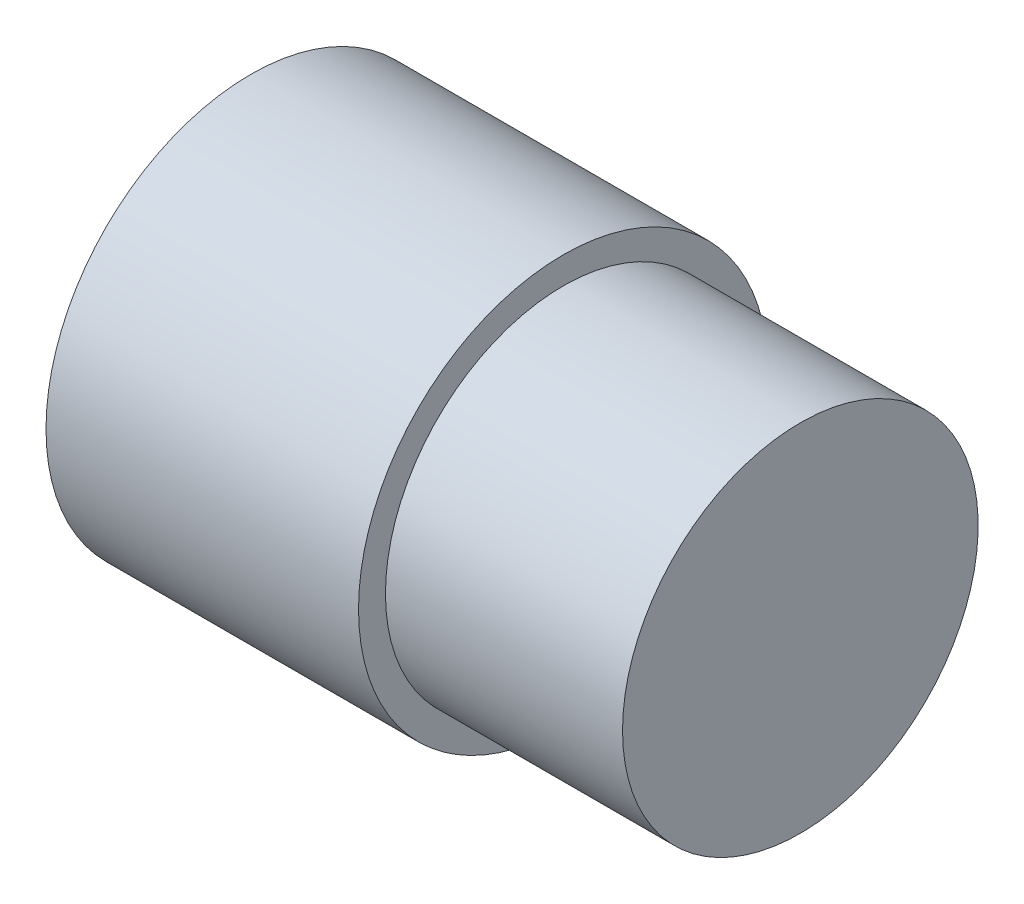
ISO-10303-21;
HEADER;
FILE_DESCRIPTION(('STEP AP214'),'2;1');
FILE_NAME('part.step','',(''),(''),'','','');
FILE_SCHEMA(('AUTOMOTIVE_DESIGN { 1 0 10303 214 1 1 1 1 }'));
ENDSEC;
DATA;
#1=APPLICATION_CONTEXT('core data for automotive mechanical design processes');
#2=APPLICATION_PROTOCOL_DEFINITION('international standard','automotive_design',2000,#1);
#3=PRODUCT_CONTEXT('',#1,'mechanical');
#4=PRODUCT('Part','Part','',(#3));
#5=PRODUCT_RELATED_PRODUCT_CATEGORY('part','',(#4));
#6=PRODUCT_DEFINITION_FORMATION('','',#4);
#7=PRODUCT_DEFINITION_CONTEXT('part definition',#1,'design');
#8=PRODUCT_DEFINITION('design','',#6,#7);
#9=PRODUCT_DEFINITION_SHAPE('','',#8);
#10=(LENGTH_UNIT() NAMED_UNIT(*) SI_UNIT(.MILLI.,.METRE.));
#11=(NAMED_UNIT(*) PLANE_ANGLE_UNIT() SI_UNIT($,.RADIAN.));
#12=(NAMED_UNIT(*) SI_UNIT($,.STERADIAN.) SOLID_ANGLE_UNIT());
#13=UNCERTAINTY_MEASURE_WITH_UNIT(LENGTH_MEASURE(1.E-05),#10,'distance_accuracy_value','');
#14=(GEOMETRIC_REPRESENTATION_CONTEXT(3) GLOBAL_UNCERTAINTY_ASSIGNED_CONTEXT((#13)) GLOBAL_UNIT_ASSIGNED_CONTEXT((#10,
#11,#12)) REPRESENTATION_CONTEXT('',''));
#15=CARTESIAN_POINT('',(0.,0.,0.));
#16=DIRECTION('',(0.,0.,1.));
#17=DIRECTION('',(1.,0.,0.));
#18=AXIS2_PLACEMENT_3D('',#15,#16,#17);
#19=CARTESIAN_POINT('',(36.5,0.,0.));
#20=DIRECTION('',(1.,0.,0.));
#21=DIRECTION('',(0.,0.,-1.));
#22=AXIS2_PLACEMENT_3D('',#19,#20,#21);
#23=PLANE('',#22);
#24=CARTESIAN_POINT('',(36.5,0.,0.));
#25=DIRECTION('',(-1.,0.,0.));
#26=DIRECTION('',(0.,0.,1.));
#27=AXIS2_PLACEMENT_3D('',#24,#25,#26);
#28=CIRCLE('',#27,16.5);
#29=CARTESIAN_POINT('',(36.5,0.,16.5));
#30=VERTEX_POINT('',#29);
#31=EDGE_CURVE('E10',#30,#30,#28,.T.);
#32=ORIENTED_EDGE('',*,*,#31,.F.);
#33=EDGE_LOOP('',(#32));
#34=FACE_BOUND('',#33,.T.);
#35=ADVANCED_FACE('F35',(#34),#23,.T.);
#36=CARTESIAN_POINT('',(-14.5,0.,0.));
#37=DIRECTION('',(-1.,0.,0.));
#38=DIRECTION('',(0.,0.,1.));
#39=AXIS2_PLACEMENT_3D('',#36,#37,#38);
#40=CYLINDRICAL_SURFACE('',#39,16.5);
#41=ORIENTED_EDGE('',*,*,#31,.T.);
#42=EDGE_LOOP('',(#41));
#43=FACE_BOUND('',#42,.T.);
#44=CARTESIAN_POINT('',(14.5,0.,0.));
#45=DIRECTION('',(-1.,0.,0.));
#46=DIRECTION('',(0.,0.,1.));
#47=AXIS2_PLACEMENT_3D('',#44,#45,#46);
#48=CIRCLE('',#47,16.5);
#49=CARTESIAN_POINT('',(14.5,0.,16.5));
#50=VERTEX_POINT('',#49);
#51=EDGE_CURVE('E41',#50,#50,#48,.T.);
#52=ORIENTED_EDGE('',*,*,#51,.F.);
#53=EDGE_LOOP('',(#52));
#54=FACE_BOUND('',#53,.T.);
#55=ADVANCED_FACE('F67',(#43,#54),#40,.T.);
#56=CARTESIAN_POINT('',(14.5,0.,0.));
#57=DIRECTION('',(-1.,0.,0.));
#58=DIRECTION('',(0.,0.,1.));
#59=AXIS2_PLACEMENT_3D('',#56,#57,#58);
#60=PLANE('',#59);
#61=CARTESIAN_POINT('',(14.5,0.,0.));
#62=DIRECTION('',(-1.,0.,0.));
#63=DIRECTION('',(0.,0.,1.));
#64=AXIS2_PLACEMENT_3D('',#61,#62,#63);
#65=CIRCLE('',#64,19.);
#66=CARTESIAN_POINT('',(14.5,0.,19.));
#67=VERTEX_POINT('',#66);
#68=EDGE_CURVE('E45',#67,#67,#65,.T.);
#69=ORIENTED_EDGE('',*,*,#68,.F.);
#70=EDGE_LOOP('',(#69));
#71=FACE_BOUND('',#70,.T.);
#72=ORIENTED_EDGE('',*,*,#51,.T.);
#73=EDGE_LOOP('',(#72));
#74=FACE_BOUND('',#73,.T.);
#75=ADVANCED_FACE('F59',(#71,#74),#60,.F.);
#76=CARTESIAN_POINT('',(-14.5,0.,0.));
#77=DIRECTION('',(-1.,0.,0.));
#78=DIRECTION('',(0.,0.,1.));
#79=AXIS2_PLACEMENT_3D('',#76,#77,#78);
#80=CYLINDRICAL_SURFACE('',#79,19.);
#81=ORIENTED_EDGE('',*,*,#68,.T.);
#82=EDGE_LOOP('',(#81));
#83=FACE_BOUND('',#82,.T.);
#84=CARTESIAN_POINT('',(-14.5,0.,0.));
#85=DIRECTION('',(-1.,0.,0.));
#86=DIRECTION('',(0.,0.,1.));
#87=AXIS2_PLACEMENT_3D('',#84,#85,#86);
#88=CIRCLE('',#87,19.);
#89=CARTESIAN_POINT('',(-14.5,0.,19.));
#90=VERTEX_POINT('',#89);
#91=EDGE_CURVE('E49',#90,#90,#88,.T.);
#92=ORIENTED_EDGE('',*,*,#91,.F.);
#93=EDGE_LOOP('',(#92));
#94=FACE_BOUND('',#93,.T.);
#95=ADVANCED_FACE('F57',(#83,#94),#80,.T.);
#96=CARTESIAN_POINT('',(-14.5,0.,0.));
#97=DIRECTION('',(-1.,0.,0.));
#98=DIRECTION('',(0.,0.,1.));
#99=AXIS2_PLACEMENT_3D('',#96,#97,#98);
#100=PLANE('',#99);
#101=ORIENTED_EDGE('',*,*,#91,.T.);
#102=EDGE_LOOP('',(#101));
#103=FACE_BOUND('',#102,.T.);
#104=ADVANCED_FACE('F55',(#103),#100,.T.);
#105=CLOSED_SHELL('',(#35,#55,#75,#95,#104));
#106=MANIFOLD_SOLID_BREP('B2',#105);
#107=ADVANCED_BREP_SHAPE_REPRESENTATION('',(#18,#106),#14);
#108=SHAPE_DEFINITION_REPRESENTATION(#9,#107);
ENDSEC;
END-ISO-10303-21;
